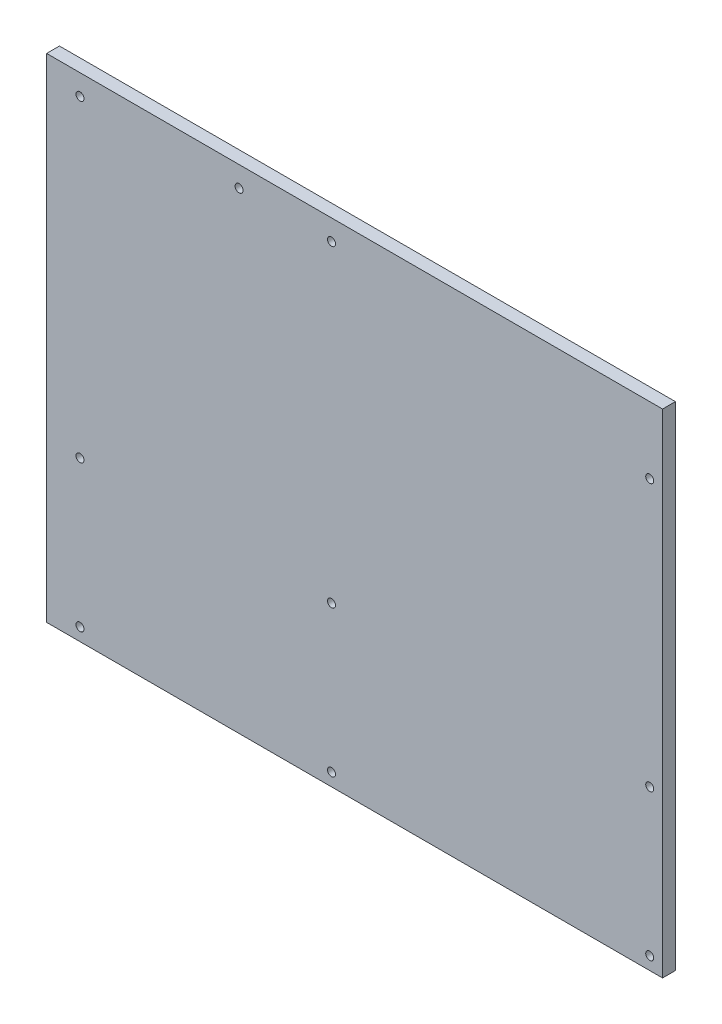
ISO-10303-21;
HEADER;
FILE_DESCRIPTION(('STEP AP214'),'2;1');
FILE_NAME('part.step','',(''),(''),'','','');
FILE_SCHEMA(('AUTOMOTIVE_DESIGN { 1 0 10303 214 1 1 1 1 }'));
ENDSEC;
DATA;
#1=APPLICATION_CONTEXT('core data for automotive mechanical design processes');
#2=APPLICATION_PROTOCOL_DEFINITION('international standard','automotive_design',2000,#1);
#3=PRODUCT_CONTEXT('',#1,'mechanical');
#4=PRODUCT('Part','Part','',(#3));
#5=PRODUCT_RELATED_PRODUCT_CATEGORY('part','',(#4));
#6=PRODUCT_DEFINITION_FORMATION('','',#4);
#7=PRODUCT_DEFINITION_CONTEXT('part definition',#1,'design');
#8=PRODUCT_DEFINITION('design','',#6,#7);
#9=PRODUCT_DEFINITION_SHAPE('','',#8);
#10=(LENGTH_UNIT() NAMED_UNIT(*) SI_UNIT(.MILLI.,.METRE.));
#11=(NAMED_UNIT(*) PLANE_ANGLE_UNIT() SI_UNIT($,.RADIAN.));
#12=(NAMED_UNIT(*) SI_UNIT($,.STERADIAN.) SOLID_ANGLE_UNIT());
#13=UNCERTAINTY_MEASURE_WITH_UNIT(LENGTH_MEASURE(1.E-05),#10,'distance_accuracy_value','');
#14=(GEOMETRIC_REPRESENTATION_CONTEXT(3) GLOBAL_UNCERTAINTY_ASSIGNED_CONTEXT((#13)) GLOBAL_UNIT_ASSIGNED_CONTEXT((#10,
#11,#12)) REPRESENTATION_CONTEXT('',''));
#15=CARTESIAN_POINT('',(0.,0.,0.));
#16=DIRECTION('',(0.,0.,1.));
#17=DIRECTION('',(1.,0.,0.));
#18=AXIS2_PLACEMENT_3D('',#15,#16,#17);
#19=CARTESIAN_POINT('',(-152.4,-121.92,6.35));
#20=DIRECTION('',(0.,1.,0.));
#21=DIRECTION('',(0.,0.,1.));
#22=AXIS2_PLACEMENT_3D('',#19,#20,#21);
#23=PLANE('',#22);
#24=DIRECTION('',(1.,0.,0.));
#25=VECTOR('',#24,1.);
#26=CARTESIAN_POINT('',(-152.4,-121.92,0.));
#27=LINE('',#26,#25);
#28=CARTESIAN_POINT('',(-152.4,-121.92,0.));
#29=VERTEX_POINT('',#28);
#30=CARTESIAN_POINT('',(152.4,-121.92,0.));
#31=VERTEX_POINT('',#30);
#32=EDGE_CURVE('E95',#29,#31,#27,.T.);
#33=ORIENTED_EDGE('',*,*,#32,.T.);
#34=DIRECTION('',(0.,0.,-1.));
#35=VECTOR('',#34,1.);
#36=CARTESIAN_POINT('',(152.4,-121.92,6.35));
#37=LINE('',#36,#35);
#38=CARTESIAN_POINT('',(152.4,-121.92,6.35));
#39=VERTEX_POINT('',#38);
#40=EDGE_CURVE('E11',#39,#31,#37,.T.);
#41=ORIENTED_EDGE('',*,*,#40,.F.);
#42=DIRECTION('',(1.,0.,0.));
#43=VECTOR('',#42,1.);
#44=CARTESIAN_POINT('',(-152.4,-121.92,6.35));
#45=LINE('',#44,#43);
#46=CARTESIAN_POINT('',(-152.4,-121.92,6.35));
#47=VERTEX_POINT('',#46);
#48=EDGE_CURVE('E81',#47,#39,#45,.T.);
#49=ORIENTED_EDGE('',*,*,#48,.F.);
#50=DIRECTION('',(0.,0.,-1.));
#51=VECTOR('',#50,1.);
#52=CARTESIAN_POINT('',(-152.4,-121.92,6.35));
#53=LINE('',#52,#51);
#54=EDGE_CURVE('E48',#47,#29,#53,.T.);
#55=ORIENTED_EDGE('',*,*,#54,.T.);
#56=EDGE_LOOP('',(#33,#41,#49,#55));
#57=FACE_BOUND('',#56,.T.);
#58=ADVANCED_FACE('F32',(#57),#23,.F.);
#59=CARTESIAN_POINT('',(152.4,-121.92,6.35));
#60=DIRECTION('',(-1.,0.,0.));
#61=DIRECTION('',(0.,0.,1.));
#62=AXIS2_PLACEMENT_3D('',#59,#60,#61);
#63=PLANE('',#62);
#64=DIRECTION('',(0.,1.,0.));
#65=VECTOR('',#64,1.);
#66=CARTESIAN_POINT('',(152.4,-121.92,0.));
#67=LINE('',#66,#65);
#68=CARTESIAN_POINT('',(152.4,121.92,0.));
#69=VERTEX_POINT('',#68);
#70=EDGE_CURVE('E86',#31,#69,#67,.T.);
#71=ORIENTED_EDGE('',*,*,#70,.T.);
#72=DIRECTION('',(0.,0.,-1.));
#73=VECTOR('',#72,1.);
#74=CARTESIAN_POINT('',(152.4,121.92,6.35));
#75=LINE('',#74,#73);
#76=CARTESIAN_POINT('',(152.4,121.92,6.35));
#77=VERTEX_POINT('',#76);
#78=EDGE_CURVE('E40',#77,#69,#75,.T.);
#79=ORIENTED_EDGE('',*,*,#78,.F.);
#80=DIRECTION('',(0.,1.,0.));
#81=VECTOR('',#80,1.);
#82=CARTESIAN_POINT('',(152.4,-121.92,6.35));
#83=LINE('',#82,#81);
#84=EDGE_CURVE('E73',#39,#77,#83,.T.);
#85=ORIENTED_EDGE('',*,*,#84,.F.);
#86=ORIENTED_EDGE('',*,*,#40,.T.);
#87=EDGE_LOOP('',(#71,#79,#85,#86));
#88=FACE_BOUND('',#87,.T.);
#89=ADVANCED_FACE('F85',(#88),#63,.F.);
#90=CARTESIAN_POINT('',(-152.4,121.92,6.35));
#91=DIRECTION('',(0.,1.,0.));
#92=DIRECTION('',(0.,0.,1.));
#93=AXIS2_PLACEMENT_3D('',#90,#91,#92);
#94=PLANE('',#93);
#95=DIRECTION('',(1.,0.,0.));
#96=VECTOR('',#95,1.);
#97=CARTESIAN_POINT('',(-152.4,121.92,0.));
#98=LINE('',#97,#96);
#99=CARTESIAN_POINT('',(-152.4,121.92,0.));
#100=VERTEX_POINT('',#99);
#101=EDGE_CURVE('E99',#100,#69,#98,.T.);
#102=ORIENTED_EDGE('',*,*,#101,.F.);
#103=DIRECTION('',(0.,0.,-1.));
#104=VECTOR('',#103,1.);
#105=CARTESIAN_POINT('',(-152.4,121.92,6.35));
#106=LINE('',#105,#104);
#107=CARTESIAN_POINT('',(-152.4,121.92,6.35));
#108=VERTEX_POINT('',#107);
#109=EDGE_CURVE('E62',#108,#100,#106,.T.);
#110=ORIENTED_EDGE('',*,*,#109,.F.);
#111=DIRECTION('',(1.,0.,0.));
#112=VECTOR('',#111,1.);
#113=CARTESIAN_POINT('',(-152.4,121.92,6.35));
#114=LINE('',#113,#112);
#115=EDGE_CURVE('E80',#108,#77,#114,.T.);
#116=ORIENTED_EDGE('',*,*,#115,.T.);
#117=ORIENTED_EDGE('',*,*,#78,.T.);
#118=EDGE_LOOP('',(#102,#110,#116,#117));
#119=FACE_BOUND('',#118,.T.);
#120=ADVANCED_FACE('F89',(#119),#94,.T.);
#121=CARTESIAN_POINT('',(-152.4,-121.92,6.35));
#122=DIRECTION('',(-1.,0.,0.));
#123=DIRECTION('',(0.,0.,1.));
#124=AXIS2_PLACEMENT_3D('',#121,#122,#123);
#125=PLANE('',#124);
#126=DIRECTION('',(0.,1.,0.));
#127=VECTOR('',#126,1.);
#128=CARTESIAN_POINT('',(-152.4,-121.92,0.));
#129=LINE('',#128,#127);
#130=EDGE_CURVE('E101',#29,#100,#129,.T.);
#131=ORIENTED_EDGE('',*,*,#130,.F.);
#132=ORIENTED_EDGE('',*,*,#54,.F.);
#133=DIRECTION('',(0.,1.,0.));
#134=VECTOR('',#133,1.);
#135=CARTESIAN_POINT('',(-152.4,-121.92,6.35));
#136=LINE('',#135,#134);
#137=EDGE_CURVE('E90',#47,#108,#136,.T.);
#138=ORIENTED_EDGE('',*,*,#137,.T.);
#139=ORIENTED_EDGE('',*,*,#109,.T.);
#140=EDGE_LOOP('',(#131,#132,#138,#139));
#141=FACE_BOUND('',#140,.T.);
#142=ADVANCED_FACE('F180',(#141),#125,.T.);
#143=CARTESIAN_POINT('',(0.,0.,6.35));
#144=DIRECTION('',(0.,0.,1.));
#145=DIRECTION('',(1.,0.,0.));
#146=AXIS2_PLACEMENT_3D('',#143,#144,#145);
#147=PLANE('',#146);
#148=CARTESIAN_POINT('',(146.05,-115.57,6.35));
#149=DIRECTION('',(0.,0.,1.));
#150=DIRECTION('',(1.,0.,0.));
#151=AXIS2_PLACEMENT_3D('',#148,#149,#150);
#152=CIRCLE('',#151,1.97993);
#153=CARTESIAN_POINT('',(148.02993,-115.57,6.35));
#154=VERTEX_POINT('',#153);
#155=EDGE_CURVE('E144',#154,#154,#152,.T.);
#156=ORIENTED_EDGE('',*,*,#155,.F.);
#157=EDGE_LOOP('',(#156));
#158=FACE_BOUND('',#157,.T.);
#159=CARTESIAN_POINT('',(-135.89,111.76,6.35));
#160=DIRECTION('',(0.,0.,1.));
#161=DIRECTION('',(1.,0.,0.));
#162=AXIS2_PLACEMENT_3D('',#159,#160,#161);
#163=CIRCLE('',#162,1.97993);
#164=CARTESIAN_POINT('',(-133.91007,111.76,6.35));
#165=VERTEX_POINT('',#164);
#166=EDGE_CURVE('E137',#165,#165,#163,.T.);
#167=ORIENTED_EDGE('',*,*,#166,.F.);
#168=EDGE_LOOP('',(#167));
#169=FACE_BOUND('',#168,.T.);
#170=CARTESIAN_POINT('',(-57.15,111.76,6.35));
#171=DIRECTION('',(0.,0.,1.));
#172=DIRECTION('',(1.,0.,0.));
#173=AXIS2_PLACEMENT_3D('',#170,#171,#172);
#174=CIRCLE('',#173,1.97993);
#175=CARTESIAN_POINT('',(-55.17007,111.76,6.35));
#176=VERTEX_POINT('',#175);
#177=EDGE_CURVE('E161',#176,#176,#174,.T.);
#178=ORIENTED_EDGE('',*,*,#177,.F.);
#179=EDGE_LOOP('',(#178));
#180=FACE_BOUND('',#179,.T.);
#181=CARTESIAN_POINT('',(-11.43,111.76,6.35));
#182=DIRECTION('',(0.,0.,1.));
#183=DIRECTION('',(1.,0.,0.));
#184=AXIS2_PLACEMENT_3D('',#181,#182,#183);
#185=CIRCLE('',#184,1.97993);
#186=CARTESIAN_POINT('',(-9.45006999999998,111.76,6.35));
#187=VERTEX_POINT('',#186);
#188=EDGE_CURVE('E155',#187,#187,#185,.T.);
#189=ORIENTED_EDGE('',*,*,#188,.F.);
#190=EDGE_LOOP('',(#189));
#191=FACE_BOUND('',#190,.T.);
#192=CARTESIAN_POINT('',(146.05,88.9,6.35));
#193=DIRECTION('',(0.,0.,1.));
#194=DIRECTION('',(1.,0.,0.));
#195=AXIS2_PLACEMENT_3D('',#192,#193,#194);
#196=CIRCLE('',#195,1.97993);
#197=CARTESIAN_POINT('',(148.02993,88.9,6.35));
#198=VERTEX_POINT('',#197);
#199=EDGE_CURVE('E149',#198,#198,#196,.T.);
#200=ORIENTED_EDGE('',*,*,#199,.F.);
#201=EDGE_LOOP('',(#200));
#202=FACE_BOUND('',#201,.T.);
#203=CARTESIAN_POINT('',(-11.43,-115.57,6.35));
#204=DIRECTION('',(0.,0.,1.));
#205=DIRECTION('',(1.,0.,0.));
#206=AXIS2_PLACEMENT_3D('',#203,#204,#205);
#207=CIRCLE('',#206,1.97993);
#208=CARTESIAN_POINT('',(-9.45006999999995,-115.57,6.35));
#209=VERTEX_POINT('',#208);
#210=EDGE_CURVE('E113',#209,#209,#207,.T.);
#211=ORIENTED_EDGE('',*,*,#210,.F.);
#212=EDGE_LOOP('',(#211));
#213=FACE_BOUND('',#212,.T.);
#214=CARTESIAN_POINT('',(-135.89,-115.57,6.35));
#215=DIRECTION('',(0.,0.,1.));
#216=DIRECTION('',(1.,0.,0.));
#217=AXIS2_PLACEMENT_3D('',#214,#215,#216);
#218=CIRCLE('',#217,1.97993);
#219=CARTESIAN_POINT('',(-133.91007,-115.57,6.35));
#220=VERTEX_POINT('',#219);
#221=EDGE_CURVE('E120',#220,#220,#218,.T.);
#222=ORIENTED_EDGE('',*,*,#221,.F.);
#223=EDGE_LOOP('',(#222));
#224=FACE_BOUND('',#223,.T.);
#225=CARTESIAN_POINT('',(146.05,-43.18,6.35));
#226=DIRECTION('',(0.,0.,1.));
#227=DIRECTION('',(1.,0.,0.));
#228=AXIS2_PLACEMENT_3D('',#225,#226,#227);
#229=CIRCLE('',#228,1.97993);
#230=CARTESIAN_POINT('',(148.02993,-43.18,6.35));
#231=VERTEX_POINT('',#230);
#232=EDGE_CURVE('E126',#231,#231,#229,.T.);
#233=ORIENTED_EDGE('',*,*,#232,.F.);
#234=EDGE_LOOP('',(#233));
#235=FACE_BOUND('',#234,.T.);
#236=CARTESIAN_POINT('',(-11.43,-43.18,6.35));
#237=DIRECTION('',(0.,0.,1.));
#238=DIRECTION('',(1.,0.,0.));
#239=AXIS2_PLACEMENT_3D('',#236,#237,#238);
#240=CIRCLE('',#239,1.97993);
#241=CARTESIAN_POINT('',(-9.45006999999997,-43.18,6.35));
#242=VERTEX_POINT('',#241);
#243=EDGE_CURVE('E132',#242,#242,#240,.T.);
#244=ORIENTED_EDGE('',*,*,#243,.F.);
#245=EDGE_LOOP('',(#244));
#246=FACE_BOUND('',#245,.T.);
#247=CARTESIAN_POINT('',(-135.89,-43.18,6.35));
#248=DIRECTION('',(0.,0.,1.));
#249=DIRECTION('',(1.,0.,0.));
#250=AXIS2_PLACEMENT_3D('',#247,#248,#249);
#251=CIRCLE('',#250,1.97993);
#252=CARTESIAN_POINT('',(-133.91007,-43.18,6.35));
#253=VERTEX_POINT('',#252);
#254=EDGE_CURVE('E107',#253,#253,#251,.T.);
#255=ORIENTED_EDGE('',*,*,#254,.F.);
#256=EDGE_LOOP('',(#255));
#257=FACE_BOUND('',#256,.T.);
#258=ORIENTED_EDGE('',*,*,#48,.T.);
#259=ORIENTED_EDGE('',*,*,#84,.T.);
#260=ORIENTED_EDGE('',*,*,#115,.F.);
#261=ORIENTED_EDGE('',*,*,#137,.F.);
#262=EDGE_LOOP('',(#258,#259,#260,#261));
#263=FACE_BOUND('',#262,.T.);
#264=ADVANCED_FACE('F77',(#158,#169,#180,#191,#202,#213,#224,#235,#246,#257,#263),#147,.T.);
#265=CARTESIAN_POINT('',(0.,0.,0.));
#266=DIRECTION('',(0.,0.,1.));
#267=DIRECTION('',(1.,0.,0.));
#268=AXIS2_PLACEMENT_3D('',#265,#266,#267);
#269=PLANE('',#268);
#270=CARTESIAN_POINT('',(146.05,-115.57,0.));
#271=DIRECTION('',(0.,0.,1.));
#272=DIRECTION('',(1.,0.,0.));
#273=AXIS2_PLACEMENT_3D('',#270,#271,#272);
#274=CIRCLE('',#273,1.97993);
#275=CARTESIAN_POINT('',(148.02993,-115.57,0.));
#276=VERTEX_POINT('',#275);
#277=EDGE_CURVE('E117',#276,#276,#274,.T.);
#278=ORIENTED_EDGE('',*,*,#277,.T.);
#279=EDGE_LOOP('',(#278));
#280=FACE_BOUND('',#279,.T.);
#281=CARTESIAN_POINT('',(-135.89,111.76,0.));
#282=DIRECTION('',(0.,0.,1.));
#283=DIRECTION('',(1.,0.,0.));
#284=AXIS2_PLACEMENT_3D('',#281,#282,#283);
#285=CIRCLE('',#284,1.97993);
#286=CARTESIAN_POINT('',(-133.91007,111.76,0.));
#287=VERTEX_POINT('',#286);
#288=EDGE_CURVE('E140',#287,#287,#285,.T.);
#289=ORIENTED_EDGE('',*,*,#288,.T.);
#290=EDGE_LOOP('',(#289));
#291=FACE_BOUND('',#290,.T.);
#292=CARTESIAN_POINT('',(-57.15,111.76,0.));
#293=DIRECTION('',(0.,0.,1.));
#294=DIRECTION('',(1.,0.,0.));
#295=AXIS2_PLACEMENT_3D('',#292,#293,#294);
#296=CIRCLE('',#295,1.97993);
#297=CARTESIAN_POINT('',(-55.17007,111.76,0.));
#298=VERTEX_POINT('',#297);
#299=EDGE_CURVE('E141',#298,#298,#296,.T.);
#300=ORIENTED_EDGE('',*,*,#299,.T.);
#301=EDGE_LOOP('',(#300));
#302=FACE_BOUND('',#301,.T.);
#303=CARTESIAN_POINT('',(-11.43,111.76,0.));
#304=DIRECTION('',(0.,0.,1.));
#305=DIRECTION('',(1.,0.,0.));
#306=AXIS2_PLACEMENT_3D('',#303,#304,#305);
#307=CIRCLE('',#306,1.97993);
#308=CARTESIAN_POINT('',(-9.45006999999998,111.76,0.));
#309=VERTEX_POINT('',#308);
#310=EDGE_CURVE('E158',#309,#309,#307,.T.);
#311=ORIENTED_EDGE('',*,*,#310,.T.);
#312=EDGE_LOOP('',(#311));
#313=FACE_BOUND('',#312,.T.);
#314=CARTESIAN_POINT('',(146.05,88.9,0.));
#315=DIRECTION('',(0.,0.,1.));
#316=DIRECTION('',(1.,0.,0.));
#317=AXIS2_PLACEMENT_3D('',#314,#315,#316);
#318=CIRCLE('',#317,1.97993);
#319=CARTESIAN_POINT('',(148.02993,88.9,0.));
#320=VERTEX_POINT('',#319);
#321=EDGE_CURVE('E152',#320,#320,#318,.T.);
#322=ORIENTED_EDGE('',*,*,#321,.T.);
#323=EDGE_LOOP('',(#322));
#324=FACE_BOUND('',#323,.T.);
#325=CARTESIAN_POINT('',(-11.43,-115.57,0.));
#326=DIRECTION('',(0.,0.,1.));
#327=DIRECTION('',(1.,0.,0.));
#328=AXIS2_PLACEMENT_3D('',#325,#326,#327);
#329=CIRCLE('',#328,1.97993);
#330=CARTESIAN_POINT('',(-9.45006999999995,-115.57,0.));
#331=VERTEX_POINT('',#330);
#332=EDGE_CURVE('E116',#331,#331,#329,.T.);
#333=ORIENTED_EDGE('',*,*,#332,.T.);
#334=EDGE_LOOP('',(#333));
#335=FACE_BOUND('',#334,.T.);
#336=CARTESIAN_POINT('',(-135.89,-115.57,0.));
#337=DIRECTION('',(0.,0.,1.));
#338=DIRECTION('',(1.,0.,0.));
#339=AXIS2_PLACEMENT_3D('',#336,#337,#338);
#340=CIRCLE('',#339,1.97993);
#341=CARTESIAN_POINT('',(-133.91007,-115.57,0.));
#342=VERTEX_POINT('',#341);
#343=EDGE_CURVE('E123',#342,#342,#340,.T.);
#344=ORIENTED_EDGE('',*,*,#343,.T.);
#345=EDGE_LOOP('',(#344));
#346=FACE_BOUND('',#345,.T.);
#347=CARTESIAN_POINT('',(146.05,-43.18,0.));
#348=DIRECTION('',(0.,0.,1.));
#349=DIRECTION('',(1.,0.,0.));
#350=AXIS2_PLACEMENT_3D('',#347,#348,#349);
#351=CIRCLE('',#350,1.97993);
#352=CARTESIAN_POINT('',(148.02993,-43.18,0.));
#353=VERTEX_POINT('',#352);
#354=EDGE_CURVE('E129',#353,#353,#351,.T.);
#355=ORIENTED_EDGE('',*,*,#354,.T.);
#356=EDGE_LOOP('',(#355));
#357=FACE_BOUND('',#356,.T.);
#358=CARTESIAN_POINT('',(-11.43,-43.18,0.));
#359=DIRECTION('',(0.,0.,1.));
#360=DIRECTION('',(1.,0.,0.));
#361=AXIS2_PLACEMENT_3D('',#358,#359,#360);
#362=CIRCLE('',#361,1.97993);
#363=CARTESIAN_POINT('',(-9.45006999999997,-43.18,0.));
#364=VERTEX_POINT('',#363);
#365=EDGE_CURVE('E110',#364,#364,#362,.T.);
#366=ORIENTED_EDGE('',*,*,#365,.T.);
#367=EDGE_LOOP('',(#366));
#368=FACE_BOUND('',#367,.T.);
#369=CARTESIAN_POINT('',(-135.89,-43.18,0.));
#370=DIRECTION('',(0.,0.,1.));
#371=DIRECTION('',(1.,0.,0.));
#372=AXIS2_PLACEMENT_3D('',#369,#370,#371);
#373=CIRCLE('',#372,1.97993);
#374=CARTESIAN_POINT('',(-133.91007,-43.18,0.));
#375=VERTEX_POINT('',#374);
#376=EDGE_CURVE('E97',#375,#375,#373,.T.);
#377=ORIENTED_EDGE('',*,*,#376,.T.);
#378=EDGE_LOOP('',(#377));
#379=FACE_BOUND('',#378,.T.);
#380=ORIENTED_EDGE('',*,*,#32,.F.);
#381=ORIENTED_EDGE('',*,*,#130,.T.);
#382=ORIENTED_EDGE('',*,*,#101,.T.);
#383=ORIENTED_EDGE('',*,*,#70,.F.);
#384=EDGE_LOOP('',(#380,#381,#382,#383));
#385=FACE_BOUND('',#384,.T.);
#386=ADVANCED_FACE('F167',(#280,#291,#302,#313,#324,#335,#346,#357,#368,#379,#385),#269,.F.);
#387=CARTESIAN_POINT('',(-135.89,-43.18,0.));
#388=DIRECTION('',(0.,0.,1.));
#389=DIRECTION('',(1.,0.,0.));
#390=AXIS2_PLACEMENT_3D('',#387,#388,#389);
#391=CYLINDRICAL_SURFACE('',#390,1.97993);
#392=ORIENTED_EDGE('',*,*,#376,.F.);
#393=EDGE_LOOP('',(#392));
#394=FACE_BOUND('',#393,.T.);
#395=ORIENTED_EDGE('',*,*,#254,.T.);
#396=EDGE_LOOP('',(#395));
#397=FACE_BOUND('',#396,.T.);
#398=ADVANCED_FACE('F197',(#394,#397),#391,.F.);
#399=CARTESIAN_POINT('',(-11.43,-43.18,0.));
#400=DIRECTION('',(0.,0.,1.));
#401=DIRECTION('',(1.,0.,0.));
#402=AXIS2_PLACEMENT_3D('',#399,#400,#401);
#403=CYLINDRICAL_SURFACE('',#402,1.97993);
#404=ORIENTED_EDGE('',*,*,#365,.F.);
#405=EDGE_LOOP('',(#404));
#406=FACE_BOUND('',#405,.T.);
#407=ORIENTED_EDGE('',*,*,#243,.T.);
#408=EDGE_LOOP('',(#407));
#409=FACE_BOUND('',#408,.T.);
#410=ADVANCED_FACE('F199',(#406,#409),#403,.F.);
#411=CARTESIAN_POINT('',(146.05,-43.18,0.));
#412=DIRECTION('',(0.,0.,1.));
#413=DIRECTION('',(1.,0.,0.));
#414=AXIS2_PLACEMENT_3D('',#411,#412,#413);
#415=CYLINDRICAL_SURFACE('',#414,1.97993);
#416=ORIENTED_EDGE('',*,*,#354,.F.);
#417=EDGE_LOOP('',(#416));
#418=FACE_BOUND('',#417,.T.);
#419=ORIENTED_EDGE('',*,*,#232,.T.);
#420=EDGE_LOOP('',(#419));
#421=FACE_BOUND('',#420,.T.);
#422=ADVANCED_FACE('F206',(#418,#421),#415,.F.);
#423=CARTESIAN_POINT('',(-135.89,-115.57,0.));
#424=DIRECTION('',(0.,0.,1.));
#425=DIRECTION('',(1.,0.,0.));
#426=AXIS2_PLACEMENT_3D('',#423,#424,#425);
#427=CYLINDRICAL_SURFACE('',#426,1.97993);
#428=ORIENTED_EDGE('',*,*,#343,.F.);
#429=EDGE_LOOP('',(#428));
#430=FACE_BOUND('',#429,.T.);
#431=ORIENTED_EDGE('',*,*,#221,.T.);
#432=EDGE_LOOP('',(#431));
#433=FACE_BOUND('',#432,.T.);
#434=ADVANCED_FACE('F268',(#430,#433),#427,.F.);
#435=CARTESIAN_POINT('',(-11.43,-115.57,0.));
#436=DIRECTION('',(0.,0.,1.));
#437=DIRECTION('',(1.,0.,0.));
#438=AXIS2_PLACEMENT_3D('',#435,#436,#437);
#439=CYLINDRICAL_SURFACE('',#438,1.97993);
#440=ORIENTED_EDGE('',*,*,#332,.F.);
#441=EDGE_LOOP('',(#440));
#442=FACE_BOUND('',#441,.T.);
#443=ORIENTED_EDGE('',*,*,#210,.T.);
#444=EDGE_LOOP('',(#443));
#445=FACE_BOUND('',#444,.T.);
#446=ADVANCED_FACE('F277',(#442,#445),#439,.F.);
#447=CARTESIAN_POINT('',(146.05,88.9,0.));
#448=DIRECTION('',(0.,0.,1.));
#449=DIRECTION('',(1.,0.,0.));
#450=AXIS2_PLACEMENT_3D('',#447,#448,#449);
#451=CYLINDRICAL_SURFACE('',#450,1.97993);
#452=ORIENTED_EDGE('',*,*,#321,.F.);
#453=EDGE_LOOP('',(#452));
#454=FACE_BOUND('',#453,.T.);
#455=ORIENTED_EDGE('',*,*,#199,.T.);
#456=EDGE_LOOP('',(#455));
#457=FACE_BOUND('',#456,.T.);
#458=ADVANCED_FACE('F286',(#454,#457),#451,.F.);
#459=CARTESIAN_POINT('',(-11.43,111.76,0.));
#460=DIRECTION('',(0.,0.,1.));
#461=DIRECTION('',(1.,0.,0.));
#462=AXIS2_PLACEMENT_3D('',#459,#460,#461);
#463=CYLINDRICAL_SURFACE('',#462,1.97993);
#464=ORIENTED_EDGE('',*,*,#310,.F.);
#465=EDGE_LOOP('',(#464));
#466=FACE_BOUND('',#465,.T.);
#467=ORIENTED_EDGE('',*,*,#188,.T.);
#468=EDGE_LOOP('',(#467));
#469=FACE_BOUND('',#468,.T.);
#470=ADVANCED_FACE('F174',(#466,#469),#463,.F.);
#471=CARTESIAN_POINT('',(-57.15,111.76,0.));
#472=DIRECTION('',(0.,0.,1.));
#473=DIRECTION('',(1.,0.,0.));
#474=AXIS2_PLACEMENT_3D('',#471,#472,#473);
#475=CYLINDRICAL_SURFACE('',#474,1.97993);
#476=ORIENTED_EDGE('',*,*,#299,.F.);
#477=EDGE_LOOP('',(#476));
#478=FACE_BOUND('',#477,.T.);
#479=ORIENTED_EDGE('',*,*,#177,.T.);
#480=EDGE_LOOP('',(#479));
#481=FACE_BOUND('',#480,.T.);
#482=ADVANCED_FACE('F170',(#478,#481),#475,.F.);
#483=CARTESIAN_POINT('',(-135.89,111.76,0.));
#484=DIRECTION('',(0.,0.,1.));
#485=DIRECTION('',(1.,0.,0.));
#486=AXIS2_PLACEMENT_3D('',#483,#484,#485);
#487=CYLINDRICAL_SURFACE('',#486,1.97993);
#488=ORIENTED_EDGE('',*,*,#288,.F.);
#489=EDGE_LOOP('',(#488));
#490=FACE_BOUND('',#489,.T.);
#491=ORIENTED_EDGE('',*,*,#166,.T.);
#492=EDGE_LOOP('',(#491));
#493=FACE_BOUND('',#492,.T.);
#494=ADVANCED_FACE('F173',(#490,#493),#487,.F.);
#495=CARTESIAN_POINT('',(146.05,-115.57,0.));
#496=DIRECTION('',(0.,0.,1.));
#497=DIRECTION('',(1.,0.,0.));
#498=AXIS2_PLACEMENT_3D('',#495,#496,#497);
#499=CYLINDRICAL_SURFACE('',#498,1.97993);
#500=ORIENTED_EDGE('',*,*,#277,.F.);
#501=EDGE_LOOP('',(#500));
#502=FACE_BOUND('',#501,.T.);
#503=ORIENTED_EDGE('',*,*,#155,.T.);
#504=EDGE_LOOP('',(#503));
#505=FACE_BOUND('',#504,.T.);
#506=ADVANCED_FACE('F315',(#502,#505),#499,.F.);
#507=CLOSED_SHELL('',(#58,#89,#120,#142,#264,#386,#398,#410,#422,#434,#446,#458,#470,#482,#494,#506));
#508=MANIFOLD_SOLID_BREP('B2',#507);
#509=ADVANCED_BREP_SHAPE_REPRESENTATION('',(#18,#508),#14);
#510=SHAPE_DEFINITION_REPRESENTATION(#9,#509);
ENDSEC;
END-ISO-10303-21;
